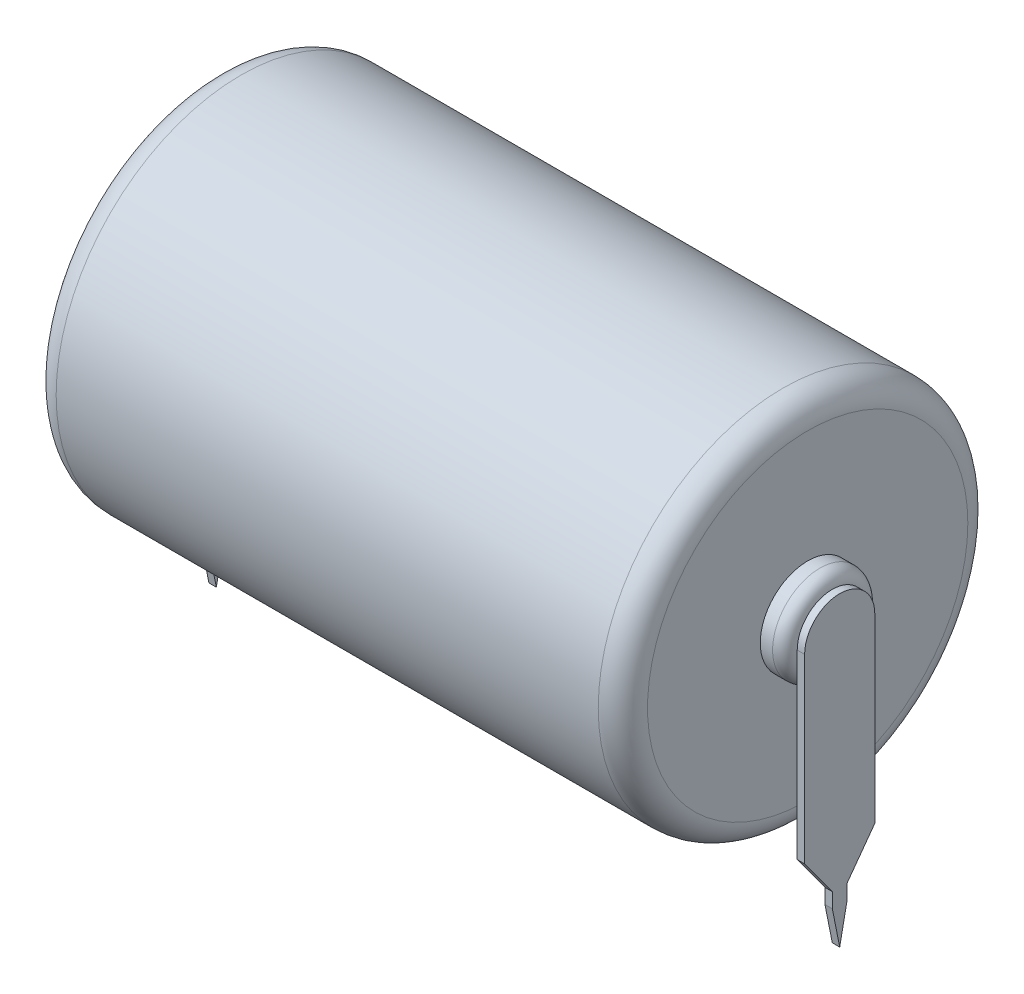
ISO-10303-21;
HEADER;
FILE_DESCRIPTION(('STEP AP214'),'2;1');
FILE_NAME('part.step','',(''),(''),'','','');
FILE_SCHEMA(('AUTOMOTIVE_DESIGN { 1 0 10303 214 1 1 1 1 }'));
ENDSEC;
DATA;
#1=APPLICATION_CONTEXT('core data for automotive mechanical design processes');
#2=APPLICATION_PROTOCOL_DEFINITION('international standard','automotive_design',2000,#1);
#3=PRODUCT_CONTEXT('',#1,'mechanical');
#4=PRODUCT('Part','Part','',(#3));
#5=PRODUCT_RELATED_PRODUCT_CATEGORY('part','',(#4));
#6=PRODUCT_DEFINITION_FORMATION('','',#4);
#7=PRODUCT_DEFINITION_CONTEXT('part definition',#1,'design');
#8=PRODUCT_DEFINITION('design','',#6,#7);
#9=PRODUCT_DEFINITION_SHAPE('','',#8);
#10=(LENGTH_UNIT() NAMED_UNIT(*) SI_UNIT(.MILLI.,.METRE.));
#11=(NAMED_UNIT(*) PLANE_ANGLE_UNIT() SI_UNIT($,.RADIAN.));
#12=(NAMED_UNIT(*) SI_UNIT($,.STERADIAN.) SOLID_ANGLE_UNIT());
#13=UNCERTAINTY_MEASURE_WITH_UNIT(LENGTH_MEASURE(1.E-05),#10,'distance_accuracy_value','');
#14=(GEOMETRIC_REPRESENTATION_CONTEXT(3) GLOBAL_UNCERTAINTY_ASSIGNED_CONTEXT((#13)) GLOBAL_UNIT_ASSIGNED_CONTEXT((#10,
#11,#12)) REPRESENTATION_CONTEXT('',''));
#15=CARTESIAN_POINT('',(0.,0.,0.));
#16=DIRECTION('',(0.,0.,1.));
#17=DIRECTION('',(1.,0.,0.));
#18=AXIS2_PLACEMENT_3D('',#15,#16,#17);
#19=CARTESIAN_POINT('',(0.,0.,0.));
#20=DIRECTION('',(1.,0.,0.));
#21=DIRECTION('',(0.,0.,-1.));
#22=AXIS2_PLACEMENT_3D('',#19,#20,#21);
#23=PLANE('',#22);
#24=DIRECTION('',(0.,-1.,0.));
#25=VECTOR('',#24,1.);
#26=CARTESIAN_POINT('',(0.,0.,-1.4242708064188));
#27=LINE('',#26,#25);
#28=CARTESIAN_POINT('',(0.,0.,-1.4242708064188));
#29=VERTEX_POINT('',#28);
#30=CARTESIAN_POINT('',(0.,-4.9161351994369,-1.4242708064188));
#31=VERTEX_POINT('',#30);
#32=EDGE_CURVE('E57',#29,#31,#27,.T.);
#33=ORIENTED_EDGE('',*,*,#32,.F.);
#34=CARTESIAN_POINT('',(0.,0.,0.));
#35=DIRECTION('',(-1.,0.,0.));
#36=DIRECTION('',(0.,0.,1.));
#37=AXIS2_PLACEMENT_3D('',#34,#35,#36);
#38=CIRCLE('',#37,1.4242708064188);
#39=CARTESIAN_POINT('',(0.,0.,1.4242708064188));
#40=VERTEX_POINT('',#39);
#41=EDGE_CURVE('E745',#40,#29,#38,.T.);
#42=ORIENTED_EDGE('',*,*,#41,.F.);
#43=DIRECTION('',(0.,1.,0.));
#44=VECTOR('',#43,1.);
#45=CARTESIAN_POINT('',(0.,-7.36352175728321,1.4242708064188));
#46=LINE('',#45,#44);
#47=CARTESIAN_POINT('',(0.,-4.9161351994369,1.4242708064188));
#48=VERTEX_POINT('',#47);
#49=EDGE_CURVE('E62',#48,#40,#46,.T.);
#50=ORIENTED_EDGE('',*,*,#49,.F.);
#51=CARTESIAN_POINT('',(0.,0.,0.));
#52=DIRECTION('',(-1.,0.,0.));
#53=DIRECTION('',(0.,0.,1.));
#54=AXIS2_PLACEMENT_3D('',#51,#52,#53);
#55=CIRCLE('',#54,5.11829391781669);
#56=EDGE_CURVE('E308',#48,#31,#55,.T.);
#57=ORIENTED_EDGE('',*,*,#56,.T.);
#58=EDGE_LOOP('',(#33,#42,#50,#57));
#59=FACE_BOUND('',#58,.T.);
#60=ADVANCED_FACE('F41',(#59),#23,.F.);
#61=CARTESIAN_POINT('',(0.,-6.34203852637172,1.4242708064188));
#62=VERTEX_POINT('',#61);
#63=CARTESIAN_POINT('',(0.,-5.28907681094109,1.4242708064188));
#64=VERTEX_POINT('',#63);
#65=EDGE_CURVE('E800',#62,#64,#46,.T.);
#66=ORIENTED_EDGE('',*,*,#65,.F.);
#67=CARTESIAN_POINT('',(0.,0.,0.));
#68=DIRECTION('',(1.,0.,0.));
#69=DIRECTION('',(0.,0.,-1.));
#70=AXIS2_PLACEMENT_3D('',#67,#68,#69);
#71=CIRCLE('',#70,6.5);
#72=CARTESIAN_POINT('',(0.,-6.34203852637172,-1.4242708064188));
#73=VERTEX_POINT('',#72);
#74=EDGE_CURVE('E338',#62,#73,#71,.F.);
#75=ORIENTED_EDGE('',*,*,#74,.T.);
#76=CARTESIAN_POINT('',(0.,-5.28907681094109,-1.4242708064188));
#77=VERTEX_POINT('',#76);
#78=EDGE_CURVE('E734',#77,#73,#27,.T.);
#79=ORIENTED_EDGE('',*,*,#78,.F.);
#80=CARTESIAN_POINT('',(0.,0.,0.));
#81=DIRECTION('',(-1.,0.,0.));
#82=DIRECTION('',(0.,0.,1.));
#83=AXIS2_PLACEMENT_3D('',#80,#81,#82);
#84=CIRCLE('',#83,5.47748855243456);
#85=EDGE_CURVE('E313',#64,#77,#84,.T.);
#86=ORIENTED_EDGE('',*,*,#85,.F.);
#87=EDGE_LOOP('',(#66,#75,#79,#86));
#88=FACE_BOUND('',#87,.T.);
#89=ADVANCED_FACE('F406',(#88),#23,.F.);
#90=CARTESIAN_POINT('',(24.,0.,0.));
#91=DIRECTION('',(-1.,0.,0.));
#92=DIRECTION('',(0.,0.,1.));
#93=AXIS2_PLACEMENT_3D('',#90,#91,#92);
#94=CYLINDRICAL_SURFACE('',#93,7.5);
#95=CARTESIAN_POINT('',(1.,0.,0.));
#96=DIRECTION('',(1.,0.,0.));
#97=DIRECTION('',(0.,0.,-1.));
#98=AXIS2_PLACEMENT_3D('',#95,#96,#97);
#99=CIRCLE('',#98,7.5);
#100=CARTESIAN_POINT('',(1.,0.,-7.5));
#101=VERTEX_POINT('',#100);
#102=EDGE_CURVE('E334',#101,#101,#99,.T.);
#103=ORIENTED_EDGE('',*,*,#102,.T.);
#104=EDGE_LOOP('',(#103));
#105=FACE_BOUND('',#104,.T.);
#106=CARTESIAN_POINT('',(23.,0.,0.));
#107=DIRECTION('',(1.,0.,0.));
#108=DIRECTION('',(0.,0.,-1.));
#109=AXIS2_PLACEMENT_3D('',#106,#107,#108);
#110=CIRCLE('',#109,7.5);
#111=CARTESIAN_POINT('',(23.,0.,-7.5));
#112=VERTEX_POINT('',#111);
#113=EDGE_CURVE('E330',#112,#112,#110,.F.);
#114=ORIENTED_EDGE('',*,*,#113,.T.);
#115=EDGE_LOOP('',(#114));
#116=FACE_BOUND('',#115,.T.);
#117=ADVANCED_FACE('F411',(#105,#116),#94,.T.);
#118=CARTESIAN_POINT('',(24.,0.,0.));
#119=DIRECTION('',(1.,0.,0.));
#120=DIRECTION('',(0.,0.,-1.));
#121=AXIS2_PLACEMENT_3D('',#118,#119,#120);
#122=PLANE('',#121);
#123=CARTESIAN_POINT('',(24.,0.,0.));
#124=DIRECTION('',(1.,0.,0.));
#125=DIRECTION('',(0.,0.,-1.));
#126=AXIS2_PLACEMENT_3D('',#123,#124,#125);
#127=CIRCLE('',#126,1.9242708064188);
#128=CARTESIAN_POINT('',(24.,0.,-1.9242708064188));
#129=VERTEX_POINT('',#128);
#130=EDGE_CURVE('E322',#129,#129,#127,.T.);
#131=ORIENTED_EDGE('',*,*,#130,.F.);
#132=EDGE_LOOP('',(#131));
#133=FACE_BOUND('',#132,.T.);
#134=CARTESIAN_POINT('',(24.,0.,0.));
#135=DIRECTION('',(1.,0.,0.));
#136=DIRECTION('',(0.,0.,-1.));
#137=AXIS2_PLACEMENT_3D('',#134,#135,#136);
#138=CIRCLE('',#137,6.5);
#139=CARTESIAN_POINT('',(24.,0.,-6.5));
#140=VERTEX_POINT('',#139);
#141=EDGE_CURVE('E342',#140,#140,#138,.T.);
#142=ORIENTED_EDGE('',*,*,#141,.T.);
#143=EDGE_LOOP('',(#142));
#144=FACE_BOUND('',#143,.T.);
#145=ADVANCED_FACE('F415',(#133,#144),#122,.T.);
#146=CARTESIAN_POINT('',(1.,0.,0.));
#147=DIRECTION('',(1.,0.,0.));
#148=DIRECTION('',(0.,0.,-1.));
#149=AXIS2_PLACEMENT_3D('',#146,#147,#148);
#150=TOROIDAL_SURFACE('',#149,6.5,1.);
#151=EDGE_CURVE('E339',#73,#62,#71,.F.);
#152=ORIENTED_EDGE('',*,*,#151,.F.);
#153=ORIENTED_EDGE('',*,*,#74,.F.);
#154=EDGE_LOOP('',(#152,#153));
#155=FACE_BOUND('',#154,.T.);
#156=ORIENTED_EDGE('',*,*,#102,.F.);
#157=EDGE_LOOP('',(#156));
#158=FACE_BOUND('',#157,.T.);
#159=ADVANCED_FACE('F420',(#155,#158),#150,.T.);
#160=CARTESIAN_POINT('',(23.,0.,0.));
#161=DIRECTION('',(1.,0.,0.));
#162=DIRECTION('',(0.,0.,-1.));
#163=AXIS2_PLACEMENT_3D('',#160,#161,#162);
#164=TOROIDAL_SURFACE('',#163,6.5,1.);
#165=ORIENTED_EDGE('',*,*,#113,.F.);
#166=EDGE_LOOP('',(#165));
#167=FACE_BOUND('',#166,.T.);
#168=ORIENTED_EDGE('',*,*,#141,.F.);
#169=EDGE_LOOP('',(#168));
#170=FACE_BOUND('',#169,.T.);
#171=ADVANCED_FACE('F422',(#167,#170),#164,.T.);
#172=CARTESIAN_POINT('',(25.,0.,0.));
#173=DIRECTION('',(-1.,0.,0.));
#174=DIRECTION('',(0.,0.,1.));
#175=AXIS2_PLACEMENT_3D('',#172,#173,#174);
#176=CYLINDRICAL_SURFACE('',#175,1.9242708064188);
#177=CARTESIAN_POINT('',(24.5,0.,0.));
#178=DIRECTION('',(1.,0.,0.));
#179=DIRECTION('',(0.,0.,-1.));
#180=AXIS2_PLACEMENT_3D('',#177,#178,#179);
#181=CIRCLE('',#180,1.9242708064188);
#182=CARTESIAN_POINT('',(24.5,0.,-1.9242708064188));
#183=VERTEX_POINT('',#182);
#184=EDGE_CURVE('E11',#183,#183,#181,.F.);
#185=ORIENTED_EDGE('',*,*,#184,.T.);
#186=EDGE_LOOP('',(#185));
#187=FACE_BOUND('',#186,.T.);
#188=ORIENTED_EDGE('',*,*,#130,.T.);
#189=EDGE_LOOP('',(#188));
#190=FACE_BOUND('',#189,.T.);
#191=ADVANCED_FACE('F425',(#187,#190),#176,.T.);
#192=CARTESIAN_POINT('',(24.5,0.,0.));
#193=DIRECTION('',(1.,0.,0.));
#194=DIRECTION('',(0.,0.,-1.));
#195=AXIS2_PLACEMENT_3D('',#192,#193,#194);
#196=TOROIDAL_SURFACE('',#195,1.4242708064188,0.5);
#197=ORIENTED_EDGE('',*,*,#184,.F.);
#198=EDGE_LOOP('',(#197));
#199=FACE_BOUND('',#198,.T.);
#200=CARTESIAN_POINT('',(25.,0.,0.));
#201=DIRECTION('',(1.,0.,0.));
#202=DIRECTION('',(0.,0.,-1.));
#203=AXIS2_PLACEMENT_3D('',#200,#201,#202);
#204=CIRCLE('',#203,1.4242708064188);
#205=CARTESIAN_POINT('',(25.,0.,-1.4242708064188));
#206=VERTEX_POINT('',#205);
#207=CARTESIAN_POINT('',(25.,0.,1.4242708064188));
#208=VERTEX_POINT('',#207);
#209=EDGE_CURVE('E50',#206,#208,#204,.T.);
#210=ORIENTED_EDGE('',*,*,#209,.F.);
#211=EDGE_CURVE('E345',#208,#206,#204,.T.);
#212=ORIENTED_EDGE('',*,*,#211,.F.);
#213=EDGE_LOOP('',(#210,#212));
#214=FACE_BOUND('',#213,.T.);
#215=ADVANCED_FACE('F43',(#199,#214),#196,.T.);
#216=CARTESIAN_POINT('',(0.3,0.,0.));
#217=DIRECTION('',(-1.,0.,0.));
#218=DIRECTION('',(0.,0.,1.));
#219=AXIS2_PLACEMENT_3D('',#216,#217,#218);
#220=CYLINDRICAL_SURFACE('',#219,5.47748855243456);
#221=CARTESIAN_POINT('',(0.3,0.,0.));
#222=DIRECTION('',(-1.,0.,0.));
#223=DIRECTION('',(0.,0.,1.));
#224=AXIS2_PLACEMENT_3D('',#221,#222,#223);
#225=CIRCLE('',#224,5.47748855243456);
#226=CARTESIAN_POINT('',(0.3,0.,5.47748855243456));
#227=VERTEX_POINT('',#226);
#228=EDGE_CURVE('E318',#227,#227,#225,.T.);
#229=ORIENTED_EDGE('',*,*,#228,.F.);
#230=EDGE_LOOP('',(#229));
#231=FACE_BOUND('',#230,.T.);
#232=EDGE_CURVE('E323',#77,#64,#84,.T.);
#233=ORIENTED_EDGE('',*,*,#232,.T.);
#234=ORIENTED_EDGE('',*,*,#85,.T.);
#235=EDGE_LOOP('',(#233,#234));
#236=FACE_BOUND('',#235,.T.);
#237=ADVANCED_FACE('F457',(#231,#236),#220,.F.);
#238=CARTESIAN_POINT('',(0.3,0.,0.));
#239=DIRECTION('',(-1.,0.,0.));
#240=DIRECTION('',(0.,0.,1.));
#241=AXIS2_PLACEMENT_3D('',#238,#239,#240);
#242=PLANE('',#241);
#243=CARTESIAN_POINT('',(0.3,0.,0.));
#244=DIRECTION('',(-1.,0.,0.));
#245=DIRECTION('',(0.,0.,1.));
#246=AXIS2_PLACEMENT_3D('',#243,#244,#245);
#247=CIRCLE('',#246,5.11829391781669);
#248=CARTESIAN_POINT('',(0.3,0.,5.11829391781669));
#249=VERTEX_POINT('',#248);
#250=EDGE_CURVE('E309',#249,#249,#247,.T.);
#251=ORIENTED_EDGE('',*,*,#250,.F.);
#252=EDGE_LOOP('',(#251));
#253=FACE_BOUND('',#252,.T.);
#254=ORIENTED_EDGE('',*,*,#228,.T.);
#255=EDGE_LOOP('',(#254));
#256=FACE_BOUND('',#255,.T.);
#257=ADVANCED_FACE('F462',(#253,#256),#242,.T.);
#258=CARTESIAN_POINT('',(0.3,0.,0.));
#259=DIRECTION('',(-1.,0.,0.));
#260=DIRECTION('',(0.,0.,1.));
#261=AXIS2_PLACEMENT_3D('',#258,#259,#260);
#262=CYLINDRICAL_SURFACE('',#261,5.11829391781669);
#263=ORIENTED_EDGE('',*,*,#250,.T.);
#264=EDGE_LOOP('',(#263));
#265=FACE_BOUND('',#264,.T.);
#266=EDGE_CURVE('E314',#31,#48,#55,.T.);
#267=ORIENTED_EDGE('',*,*,#266,.F.);
#268=ORIENTED_EDGE('',*,*,#56,.F.);
#269=EDGE_LOOP('',(#267,#268));
#270=FACE_BOUND('',#269,.T.);
#271=ADVANCED_FACE('F403',(#265,#270),#262,.T.);
#272=CARTESIAN_POINT('',(25.3,0.,0.));
#273=DIRECTION('',(-1.,0.,0.));
#274=DIRECTION('',(0.,0.,1.));
#275=AXIS2_PLACEMENT_3D('',#272,#273,#274);
#276=CYLINDRICAL_SURFACE('',#275,1.4242708064188);
#277=ORIENTED_EDGE('',*,*,#209,.T.);
#278=DIRECTION('',(-1.,0.,0.));
#279=VECTOR('',#278,1.);
#280=CARTESIAN_POINT('',(25.3,0.,1.4242708064188));
#281=LINE('',#280,#279);
#282=CARTESIAN_POINT('',(25.3,0.,1.4242708064188));
#283=VERTEX_POINT('',#282);
#284=EDGE_CURVE('E304',#283,#208,#281,.T.);
#285=ORIENTED_EDGE('',*,*,#284,.F.);
#286=CARTESIAN_POINT('',(25.3,0.,0.));
#287=DIRECTION('',(1.,0.,0.));
#288=DIRECTION('',(0.,0.,-1.));
#289=AXIS2_PLACEMENT_3D('',#286,#287,#288);
#290=CIRCLE('',#289,1.4242708064188);
#291=CARTESIAN_POINT('',(25.3,0.,-1.4242708064188));
#292=VERTEX_POINT('',#291);
#293=EDGE_CURVE('E222',#292,#283,#290,.T.);
#294=ORIENTED_EDGE('',*,*,#293,.F.);
#295=DIRECTION('',(-1.,0.,0.));
#296=VECTOR('',#295,1.);
#297=CARTESIAN_POINT('',(25.3,0.,-1.4242708064188));
#298=LINE('',#297,#296);
#299=EDGE_CURVE('E250',#292,#206,#298,.T.);
#300=ORIENTED_EDGE('',*,*,#299,.T.);
#301=EDGE_LOOP('',(#277,#285,#294,#300));
#302=FACE_BOUND('',#301,.T.);
#303=ADVANCED_FACE('F363',(#302),#276,.T.);
#304=CARTESIAN_POINT('',(25.3,0.,1.4242708064188));
#305=DIRECTION('',(0.,0.,-1.));
#306=DIRECTION('',(-1.,0.,0.));
#307=AXIS2_PLACEMENT_3D('',#304,#305,#306);
#308=PLANE('',#307);
#309=DIRECTION('',(0.,-1.,0.));
#310=VECTOR('',#309,1.);
#311=CARTESIAN_POINT('',(25.,0.,1.4242708064188));
#312=LINE('',#311,#310);
#313=CARTESIAN_POINT('',(25.,-7.36352175728321,1.4242708064188));
#314=VERTEX_POINT('',#313);
#315=EDGE_CURVE('E211',#208,#314,#312,.T.);
#316=ORIENTED_EDGE('',*,*,#315,.T.);
#317=DIRECTION('',(-1.,0.,0.));
#318=VECTOR('',#317,1.);
#319=CARTESIAN_POINT('',(25.3,-7.36352175728321,1.4242708064188));
#320=LINE('',#319,#318);
#321=CARTESIAN_POINT('',(25.3,-7.36352175728321,1.4242708064188));
#322=VERTEX_POINT('',#321);
#323=EDGE_CURVE('E300',#322,#314,#320,.T.);
#324=ORIENTED_EDGE('',*,*,#323,.F.);
#325=DIRECTION('',(0.,-1.,0.));
#326=VECTOR('',#325,1.);
#327=CARTESIAN_POINT('',(25.3,0.,1.4242708064188));
#328=LINE('',#327,#326);
#329=EDGE_CURVE('E226',#283,#322,#328,.T.);
#330=ORIENTED_EDGE('',*,*,#329,.F.);
#331=ORIENTED_EDGE('',*,*,#284,.T.);
#332=EDGE_LOOP('',(#316,#324,#330,#331));
#333=FACE_BOUND('',#332,.T.);
#334=ADVANCED_FACE('F395',(#333),#308,.F.);
#335=CARTESIAN_POINT('',(25.3,-8.61036931533486,0.511928366025113));
#336=DIRECTION('',(0.,0.590516300354505,-0.807025711496002));
#337=DIRECTION('',(0.,0.807025711496002,0.590516300354505));
#338=AXIS2_PLACEMENT_3D('',#335,#336,#337);
#339=PLANE('',#338);
#340=DIRECTION('',(0.,-0.807025711496002,-0.590516300354505));
#341=VECTOR('',#340,1.);
#342=CARTESIAN_POINT('',(25.,-8.61036931533486,0.511928366025113));
#343=LINE('',#342,#341);
#344=CARTESIAN_POINT('',(25.,-8.9,0.3));
#345=VERTEX_POINT('',#344);
#346=EDGE_CURVE('E216',#314,#345,#343,.T.);
#347=ORIENTED_EDGE('',*,*,#346,.T.);
#348=DIRECTION('',(-1.,0.,0.));
#349=VECTOR('',#348,1.);
#350=CARTESIAN_POINT('',(25.3,-8.9,0.3));
#351=LINE('',#350,#349);
#352=CARTESIAN_POINT('',(25.3,-8.9,0.3));
#353=VERTEX_POINT('',#352);
#354=EDGE_CURVE('E296',#353,#345,#351,.T.);
#355=ORIENTED_EDGE('',*,*,#354,.F.);
#356=DIRECTION('',(0.,-0.807025711496001,-0.590516300354506));
#357=VECTOR('',#356,1.);
#358=CARTESIAN_POINT('',(25.3,-7.36352175728321,1.4242708064188));
#359=LINE('',#358,#357);
#360=EDGE_CURVE('E230',#322,#353,#359,.T.);
#361=ORIENTED_EDGE('',*,*,#360,.F.);
#362=ORIENTED_EDGE('',*,*,#323,.T.);
#363=EDGE_LOOP('',(#347,#355,#361,#362));
#364=FACE_BOUND('',#363,.T.);
#365=ADVANCED_FACE('F393',(#364),#339,.F.);
#366=CARTESIAN_POINT('',(25.3,-8.9,0.3));
#367=DIRECTION('',(0.,0.,-1.));
#368=DIRECTION('',(0.,1.,0.));
#369=AXIS2_PLACEMENT_3D('',#366,#367,#368);
#370=PLANE('',#369);
#371=DIRECTION('',(0.,-1.,0.));
#372=VECTOR('',#371,1.);
#373=CARTESIAN_POINT('',(25.,-8.9,0.3));
#374=LINE('',#373,#372);
#375=CARTESIAN_POINT('',(25.,-9.5,0.3));
#376=VERTEX_POINT('',#375);
#377=EDGE_CURVE('E254',#345,#376,#374,.T.);
#378=ORIENTED_EDGE('',*,*,#377,.T.);
#379=DIRECTION('',(-1.,0.,0.));
#380=VECTOR('',#379,1.);
#381=CARTESIAN_POINT('',(25.3,-9.5,0.3));
#382=LINE('',#381,#380);
#383=CARTESIAN_POINT('',(25.3,-9.5,0.3));
#384=VERTEX_POINT('',#383);
#385=EDGE_CURVE('E292',#384,#376,#382,.T.);
#386=ORIENTED_EDGE('',*,*,#385,.F.);
#387=DIRECTION('',(0.,-1.,0.));
#388=VECTOR('',#387,1.);
#389=CARTESIAN_POINT('',(25.3,-8.9,0.3));
#390=LINE('',#389,#388);
#391=EDGE_CURVE('E233',#353,#384,#390,.T.);
#392=ORIENTED_EDGE('',*,*,#391,.F.);
#393=ORIENTED_EDGE('',*,*,#354,.T.);
#394=EDGE_LOOP('',(#378,#386,#392,#393));
#395=FACE_BOUND('',#394,.T.);
#396=ADVANCED_FACE('F389',(#395),#370,.F.);
#397=CARTESIAN_POINT('',(25.3,-9.5,0.3));
#398=DIRECTION('',(0.,0.196116135138184,-0.98058067569092));
#399=DIRECTION('',(0.,0.98058067569092,0.196116135138184));
#400=AXIS2_PLACEMENT_3D('',#397,#398,#399);
#401=PLANE('',#400);
#402=DIRECTION('',(0.,-0.98058067569092,-0.196116135138184));
#403=VECTOR('',#402,1.);
#404=CARTESIAN_POINT('',(25.,-9.5,0.3));
#405=LINE('',#404,#403);
#406=CARTESIAN_POINT('',(25.,-11.,0.));
#407=VERTEX_POINT('',#406);
#408=EDGE_CURVE('E257',#376,#407,#405,.T.);
#409=ORIENTED_EDGE('',*,*,#408,.T.);
#410=DIRECTION('',(-1.,0.,0.));
#411=VECTOR('',#410,1.);
#412=CARTESIAN_POINT('',(25.3,-11.,0.));
#413=LINE('',#412,#411);
#414=CARTESIAN_POINT('',(25.3,-11.,0.));
#415=VERTEX_POINT('',#414);
#416=EDGE_CURVE('E288',#415,#407,#413,.T.);
#417=ORIENTED_EDGE('',*,*,#416,.F.);
#418=DIRECTION('',(0.,-0.98058067569092,-0.196116135138184));
#419=VECTOR('',#418,1.);
#420=CARTESIAN_POINT('',(25.3,-9.5,0.3));
#421=LINE('',#420,#419);
#422=EDGE_CURVE('E236',#384,#415,#421,.T.);
#423=ORIENTED_EDGE('',*,*,#422,.F.);
#424=ORIENTED_EDGE('',*,*,#385,.T.);
#425=EDGE_LOOP('',(#409,#417,#423,#424));
#426=FACE_BOUND('',#425,.T.);
#427=ADVANCED_FACE('F384',(#426),#401,.F.);
#428=CARTESIAN_POINT('',(25.3,-9.5,-0.3));
#429=DIRECTION('',(0.,0.196116135138184,0.98058067569092));
#430=DIRECTION('',(0.,-0.98058067569092,0.196116135138184));
#431=AXIS2_PLACEMENT_3D('',#428,#429,#430);
#432=PLANE('',#431);
#433=DIRECTION('',(0.,0.98058067569092,-0.196116135138184));
#434=VECTOR('',#433,1.);
#435=CARTESIAN_POINT('',(25.,-9.5,-0.3));
#436=LINE('',#435,#434);
#437=CARTESIAN_POINT('',(25.,-9.5,-0.3));
#438=VERTEX_POINT('',#437);
#439=EDGE_CURVE('E260',#407,#438,#436,.T.);
#440=ORIENTED_EDGE('',*,*,#439,.T.);
#441=DIRECTION('',(-1.,0.,0.));
#442=VECTOR('',#441,1.);
#443=CARTESIAN_POINT('',(25.3,-9.5,-0.3));
#444=LINE('',#443,#442);
#445=CARTESIAN_POINT('',(25.3,-9.5,-0.3));
#446=VERTEX_POINT('',#445);
#447=EDGE_CURVE('E284',#446,#438,#444,.T.);
#448=ORIENTED_EDGE('',*,*,#447,.F.);
#449=DIRECTION('',(0.,0.98058067569092,-0.196116135138184));
#450=VECTOR('',#449,1.);
#451=CARTESIAN_POINT('',(25.3,-9.5,-0.3));
#452=LINE('',#451,#450);
#453=EDGE_CURVE('E239',#415,#446,#452,.T.);
#454=ORIENTED_EDGE('',*,*,#453,.F.);
#455=ORIENTED_EDGE('',*,*,#416,.T.);
#456=EDGE_LOOP('',(#440,#448,#454,#455));
#457=FACE_BOUND('',#456,.T.);
#458=ADVANCED_FACE('F379',(#457),#432,.F.);
#459=CARTESIAN_POINT('',(25.3,-8.9,-0.3));
#460=DIRECTION('',(0.,0.,1.));
#461=DIRECTION('',(0.,-1.,0.));
#462=AXIS2_PLACEMENT_3D('',#459,#460,#461);
#463=PLANE('',#462);
#464=DIRECTION('',(0.,1.,0.));
#465=VECTOR('',#464,1.);
#466=CARTESIAN_POINT('',(25.,-8.9,-0.3));
#467=LINE('',#466,#465);
#468=CARTESIAN_POINT('',(25.,-8.9,-0.3));
#469=VERTEX_POINT('',#468);
#470=EDGE_CURVE('E263',#438,#469,#467,.T.);
#471=ORIENTED_EDGE('',*,*,#470,.T.);
#472=DIRECTION('',(-1.,0.,0.));
#473=VECTOR('',#472,1.);
#474=CARTESIAN_POINT('',(25.3,-8.9,-0.3));
#475=LINE('',#474,#473);
#476=CARTESIAN_POINT('',(25.3,-8.9,-0.3));
#477=VERTEX_POINT('',#476);
#478=EDGE_CURVE('E280',#477,#469,#475,.T.);
#479=ORIENTED_EDGE('',*,*,#478,.F.);
#480=DIRECTION('',(0.,1.,0.));
#481=VECTOR('',#480,1.);
#482=CARTESIAN_POINT('',(25.3,-8.9,-0.3));
#483=LINE('',#482,#481);
#484=EDGE_CURVE('E242',#446,#477,#483,.T.);
#485=ORIENTED_EDGE('',*,*,#484,.F.);
#486=ORIENTED_EDGE('',*,*,#447,.T.);
#487=EDGE_LOOP('',(#471,#479,#485,#486));
#488=FACE_BOUND('',#487,.T.);
#489=ADVANCED_FACE('F375',(#488),#463,.F.);
#490=CARTESIAN_POINT('',(25.3,-7.36352175728321,-1.4242708064188));
#491=DIRECTION('',(0.,0.590516300354505,0.807025711496002));
#492=DIRECTION('',(0.,-0.807025711496002,0.590516300354505));
#493=AXIS2_PLACEMENT_3D('',#490,#491,#492);
#494=PLANE('',#493);
#495=DIRECTION('',(0.,0.807025711496002,-0.590516300354505));
#496=VECTOR('',#495,1.);
#497=CARTESIAN_POINT('',(25.,-7.36352175728321,-1.4242708064188));
#498=LINE('',#497,#496);
#499=CARTESIAN_POINT('',(25.,-7.36352175728321,-1.4242708064188));
#500=VERTEX_POINT('',#499);
#501=EDGE_CURVE('E267',#469,#500,#498,.T.);
#502=ORIENTED_EDGE('',*,*,#501,.T.);
#503=DIRECTION('',(-1.,0.,0.));
#504=VECTOR('',#503,1.);
#505=CARTESIAN_POINT('',(25.3,-7.36352175728321,-1.4242708064188));
#506=LINE('',#505,#504);
#507=CARTESIAN_POINT('',(25.3,-7.36352175728321,-1.4242708064188));
#508=VERTEX_POINT('',#507);
#509=EDGE_CURVE('E276',#508,#500,#506,.T.);
#510=ORIENTED_EDGE('',*,*,#509,.F.);
#511=DIRECTION('',(0.,0.807025711496,-0.590516300354508));
#512=VECTOR('',#511,1.);
#513=CARTESIAN_POINT('',(25.3,-8.59862377608803,-0.520522803950577));
#514=LINE('',#513,#512);
#515=EDGE_CURVE('E245',#477,#508,#514,.T.);
#516=ORIENTED_EDGE('',*,*,#515,.F.);
#517=ORIENTED_EDGE('',*,*,#478,.T.);
#518=EDGE_LOOP('',(#502,#510,#516,#517));
#519=FACE_BOUND('',#518,.T.);
#520=ADVANCED_FACE('F371',(#519),#494,.F.);
#521=CARTESIAN_POINT('',(25.3,0.,-1.4242708064188));
#522=DIRECTION('',(0.,0.,1.));
#523=DIRECTION('',(1.,0.,0.));
#524=AXIS2_PLACEMENT_3D('',#521,#522,#523);
#525=PLANE('',#524);
#526=DIRECTION('',(0.,1.,0.));
#527=VECTOR('',#526,1.);
#528=CARTESIAN_POINT('',(25.,0.,-1.4242708064188));
#529=LINE('',#528,#527);
#530=EDGE_CURVE('E227',#500,#206,#529,.T.);
#531=ORIENTED_EDGE('',*,*,#530,.T.);
#532=ORIENTED_EDGE('',*,*,#299,.F.);
#533=DIRECTION('',(0.,1.,0.));
#534=VECTOR('',#533,1.);
#535=CARTESIAN_POINT('',(25.3,0.,-1.4242708064188));
#536=LINE('',#535,#534);
#537=EDGE_CURVE('E248',#508,#292,#536,.T.);
#538=ORIENTED_EDGE('',*,*,#537,.F.);
#539=ORIENTED_EDGE('',*,*,#509,.T.);
#540=EDGE_LOOP('',(#531,#532,#538,#539));
#541=FACE_BOUND('',#540,.T.);
#542=ADVANCED_FACE('F359',(#541),#525,.F.);
#543=CARTESIAN_POINT('',(25.3,0.,0.));
#544=DIRECTION('',(1.,0.,0.));
#545=DIRECTION('',(0.,0.,-1.));
#546=AXIS2_PLACEMENT_3D('',#543,#544,#545);
#547=PLANE('',#546);
#548=ORIENTED_EDGE('',*,*,#293,.T.);
#549=ORIENTED_EDGE('',*,*,#329,.T.);
#550=ORIENTED_EDGE('',*,*,#360,.T.);
#551=ORIENTED_EDGE('',*,*,#391,.T.);
#552=ORIENTED_EDGE('',*,*,#422,.T.);
#553=ORIENTED_EDGE('',*,*,#453,.T.);
#554=ORIENTED_EDGE('',*,*,#484,.T.);
#555=ORIENTED_EDGE('',*,*,#515,.T.);
#556=ORIENTED_EDGE('',*,*,#537,.T.);
#557=EDGE_LOOP('',(#548,#549,#550,#551,#552,#553,#554,#555,#556));
#558=FACE_BOUND('',#557,.T.);
#559=ADVANCED_FACE('F365',(#558),#547,.T.);
#560=CARTESIAN_POINT('',(25.,0.,0.));
#561=DIRECTION('',(1.,0.,0.));
#562=DIRECTION('',(0.,0.,-1.));
#563=AXIS2_PLACEMENT_3D('',#560,#561,#562);
#564=PLANE('',#563);
#565=ORIENTED_EDGE('',*,*,#211,.T.);
#566=ORIENTED_EDGE('',*,*,#530,.F.);
#567=ORIENTED_EDGE('',*,*,#501,.F.);
#568=ORIENTED_EDGE('',*,*,#470,.F.);
#569=ORIENTED_EDGE('',*,*,#439,.F.);
#570=ORIENTED_EDGE('',*,*,#408,.F.);
#571=ORIENTED_EDGE('',*,*,#377,.F.);
#572=ORIENTED_EDGE('',*,*,#346,.F.);
#573=ORIENTED_EDGE('',*,*,#315,.F.);
#574=EDGE_LOOP('',(#565,#566,#567,#568,#569,#570,#571,#572,#573));
#575=FACE_BOUND('',#574,.T.);
#576=ADVANCED_FACE('F355',(#575),#564,.F.);
#577=CARTESIAN_POINT('',(0.,0.,0.));
#578=DIRECTION('',(-1.,0.,0.));
#579=DIRECTION('',(0.,0.,1.));
#580=AXIS2_PLACEMENT_3D('',#577,#578,#579);
#581=PLANE('',#580);
#582=EDGE_CURVE('E729',#31,#77,#27,.T.);
#583=ORIENTED_EDGE('',*,*,#582,.F.);
#584=ORIENTED_EDGE('',*,*,#266,.T.);
#585=EDGE_CURVE('E731',#64,#48,#46,.T.);
#586=ORIENTED_EDGE('',*,*,#585,.F.);
#587=ORIENTED_EDGE('',*,*,#232,.F.);
#588=EDGE_LOOP('',(#583,#584,#586,#587));
#589=FACE_BOUND('',#588,.T.);
#590=ADVANCED_FACE('F482',(#589),#581,.F.);
#591=CARTESIAN_POINT('',(0.,-7.36352175728321,-1.4242708064188));
#592=VERTEX_POINT('',#591);
#593=EDGE_CURVE('E743',#73,#592,#27,.T.);
#594=ORIENTED_EDGE('',*,*,#593,.F.);
#595=ORIENTED_EDGE('',*,*,#151,.T.);
#596=CARTESIAN_POINT('',(0.,-7.36352175728321,1.4242708064188));
#597=VERTEX_POINT('',#596);
#598=EDGE_CURVE('E797',#597,#62,#46,.T.);
#599=ORIENTED_EDGE('',*,*,#598,.F.);
#600=DIRECTION('',(0.,0.807025711496001,0.590516300354506));
#601=VECTOR('',#600,1.);
#602=CARTESIAN_POINT('',(0.,-8.61036931533486,0.511928366025113));
#603=LINE('',#602,#601);
#604=CARTESIAN_POINT('',(0.,-8.9,0.3));
#605=VERTEX_POINT('',#604);
#606=EDGE_CURVE('E790',#605,#597,#603,.T.);
#607=ORIENTED_EDGE('',*,*,#606,.F.);
#608=DIRECTION('',(0.,1.,0.));
#609=VECTOR('',#608,1.);
#610=CARTESIAN_POINT('',(0.,-9.5,0.3));
#611=LINE('',#610,#609);
#612=CARTESIAN_POINT('',(0.,-9.5,0.3));
#613=VERTEX_POINT('',#612);
#614=EDGE_CURVE('E785',#613,#605,#611,.T.);
#615=ORIENTED_EDGE('',*,*,#614,.F.);
#616=DIRECTION('',(0.,0.98058067569092,0.196116135138184));
#617=VECTOR('',#616,1.);
#618=CARTESIAN_POINT('',(0.,-11.,0.));
#619=LINE('',#618,#617);
#620=CARTESIAN_POINT('',(0.,-11.,0.));
#621=VERTEX_POINT('',#620);
#622=EDGE_CURVE('E779',#621,#613,#619,.T.);
#623=ORIENTED_EDGE('',*,*,#622,.F.);
#624=DIRECTION('',(0.,-0.98058067569092,0.196116135138184));
#625=VECTOR('',#624,1.);
#626=CARTESIAN_POINT('',(0.,-9.5,-0.3));
#627=LINE('',#626,#625);
#628=CARTESIAN_POINT('',(0.,-9.5,-0.3));
#629=VERTEX_POINT('',#628);
#630=EDGE_CURVE('E783',#629,#621,#627,.T.);
#631=ORIENTED_EDGE('',*,*,#630,.F.);
#632=DIRECTION('',(0.,-1.,0.));
#633=VECTOR('',#632,1.);
#634=CARTESIAN_POINT('',(0.,-8.9,-0.3));
#635=LINE('',#634,#633);
#636=CARTESIAN_POINT('',(0.,-8.9,-0.3));
#637=VERTEX_POINT('',#636);
#638=EDGE_CURVE('E792',#637,#629,#635,.T.);
#639=ORIENTED_EDGE('',*,*,#638,.F.);
#640=DIRECTION('',(0.,-0.807025711496002,0.590516300354505));
#641=VECTOR('',#640,1.);
#642=CARTESIAN_POINT('',(0.,-7.36352175728321,-1.4242708064188));
#643=LINE('',#642,#641);
#644=EDGE_CURVE('E205',#592,#637,#643,.T.);
#645=ORIENTED_EDGE('',*,*,#644,.F.);
#646=EDGE_LOOP('',(#594,#595,#599,#607,#615,#623,#631,#639,#645));
#647=FACE_BOUND('',#646,.T.);
#648=ADVANCED_FACE('F487',(#647),#581,.F.);
#649=CARTESIAN_POINT('',(-0.3,-8.9,-0.3));
#650=DIRECTION('',(0.,0.,1.));
#651=DIRECTION('',(0.,-1.,0.));
#652=AXIS2_PLACEMENT_3D('',#649,#650,#651);
#653=PLANE('',#652);
#654=ORIENTED_EDGE('',*,*,#638,.T.);
#655=DIRECTION('',(1.,0.,0.));
#656=VECTOR('',#655,1.);
#657=CARTESIAN_POINT('',(-0.3,-9.5,-0.3));
#658=LINE('',#657,#656);
#659=CARTESIAN_POINT('',(-0.3,-9.5,-0.3));
#660=VERTEX_POINT('',#659);
#661=EDGE_CURVE('E190',#660,#629,#658,.T.);
#662=ORIENTED_EDGE('',*,*,#661,.F.);
#663=DIRECTION('',(0.,-1.,0.));
#664=VECTOR('',#663,1.);
#665=CARTESIAN_POINT('',(-0.3,-8.9,-0.3));
#666=LINE('',#665,#664);
#667=CARTESIAN_POINT('',(-0.3,-8.9,-0.3));
#668=VERTEX_POINT('',#667);
#669=EDGE_CURVE('E184',#668,#660,#666,.T.);
#670=ORIENTED_EDGE('',*,*,#669,.F.);
#671=DIRECTION('',(1.,0.,0.));
#672=VECTOR('',#671,1.);
#673=CARTESIAN_POINT('',(-0.3,-8.9,-0.3));
#674=LINE('',#673,#672);
#675=EDGE_CURVE('E188',#668,#637,#674,.T.);
#676=ORIENTED_EDGE('',*,*,#675,.T.);
#677=EDGE_LOOP('',(#654,#662,#670,#676));
#678=FACE_BOUND('',#677,.T.);
#679=ADVANCED_FACE('F186',(#678),#653,.F.);
#680=CARTESIAN_POINT('',(-0.3,-9.5,-0.3));
#681=DIRECTION('',(0.,0.196116135138184,0.98058067569092));
#682=DIRECTION('',(0.,-0.98058067569092,0.196116135138184));
#683=AXIS2_PLACEMENT_3D('',#680,#681,#682);
#684=PLANE('',#683);
#685=ORIENTED_EDGE('',*,*,#630,.T.);
#686=DIRECTION('',(1.,0.,0.));
#687=VECTOR('',#686,1.);
#688=CARTESIAN_POINT('',(-0.3,-11.,0.));
#689=LINE('',#688,#687);
#690=CARTESIAN_POINT('',(-0.3,-11.,0.));
#691=VERTEX_POINT('',#690);
#692=EDGE_CURVE('E218',#691,#621,#689,.T.);
#693=ORIENTED_EDGE('',*,*,#692,.F.);
#694=DIRECTION('',(0.,-0.98058067569092,0.196116135138184));
#695=VECTOR('',#694,1.);
#696=CARTESIAN_POINT('',(-0.3,-9.5,-0.3));
#697=LINE('',#696,#695);
#698=EDGE_CURVE('E194',#660,#691,#697,.T.);
#699=ORIENTED_EDGE('',*,*,#698,.F.);
#700=ORIENTED_EDGE('',*,*,#661,.T.);
#701=EDGE_LOOP('',(#685,#693,#699,#700));
#702=FACE_BOUND('',#701,.T.);
#703=ADVANCED_FACE('F507',(#702),#684,.F.);
#704=CARTESIAN_POINT('',(-0.3,-11.,0.));
#705=DIRECTION('',(0.,0.196116135138184,-0.98058067569092));
#706=DIRECTION('',(0.,0.98058067569092,0.196116135138184));
#707=AXIS2_PLACEMENT_3D('',#704,#705,#706);
#708=PLANE('',#707);
#709=ORIENTED_EDGE('',*,*,#622,.T.);
#710=DIRECTION('',(1.,0.,0.));
#711=VECTOR('',#710,1.);
#712=CARTESIAN_POINT('',(-0.3,-9.5,0.3));
#713=LINE('',#712,#711);
#714=CARTESIAN_POINT('',(-0.3,-9.5,0.3));
#715=VERTEX_POINT('',#714);
#716=EDGE_CURVE('E770',#715,#613,#713,.T.);
#717=ORIENTED_EDGE('',*,*,#716,.F.);
#718=DIRECTION('',(0.,0.98058067569092,0.196116135138184));
#719=VECTOR('',#718,1.);
#720=CARTESIAN_POINT('',(-0.3,-11.,0.));
#721=LINE('',#720,#719);
#722=EDGE_CURVE('E780',#691,#715,#721,.T.);
#723=ORIENTED_EDGE('',*,*,#722,.F.);
#724=ORIENTED_EDGE('',*,*,#692,.T.);
#725=EDGE_LOOP('',(#709,#717,#723,#724));
#726=FACE_BOUND('',#725,.T.);
#727=ADVANCED_FACE('F516',(#726),#708,.F.);
#728=CARTESIAN_POINT('',(-0.3,-9.5,0.3));
#729=DIRECTION('',(0.,0.,-1.));
#730=DIRECTION('',(0.,1.,0.));
#731=AXIS2_PLACEMENT_3D('',#728,#729,#730);
#732=PLANE('',#731);
#733=ORIENTED_EDGE('',*,*,#614,.T.);
#734=DIRECTION('',(1.,0.,0.));
#735=VECTOR('',#734,1.);
#736=CARTESIAN_POINT('',(-0.3,-8.9,0.3));
#737=LINE('',#736,#735);
#738=CARTESIAN_POINT('',(-0.3,-8.9,0.3));
#739=VERTEX_POINT('',#738);
#740=EDGE_CURVE('E766',#739,#605,#737,.T.);
#741=ORIENTED_EDGE('',*,*,#740,.F.);
#742=DIRECTION('',(0.,1.,0.));
#743=VECTOR('',#742,1.);
#744=CARTESIAN_POINT('',(-0.3,-9.5,0.3));
#745=LINE('',#744,#743);
#746=EDGE_CURVE('E825',#715,#739,#745,.T.);
#747=ORIENTED_EDGE('',*,*,#746,.F.);
#748=ORIENTED_EDGE('',*,*,#716,.T.);
#749=EDGE_LOOP('',(#733,#741,#747,#748));
#750=FACE_BOUND('',#749,.T.);
#751=ADVANCED_FACE('F526',(#750),#732,.F.);
#752=CARTESIAN_POINT('',(-0.3,-8.61036931533486,0.511928366025113));
#753=DIRECTION('',(0.,0.590516300354506,-0.807025711496001));
#754=DIRECTION('',(0.,0.807025711496001,0.590516300354506));
#755=AXIS2_PLACEMENT_3D('',#752,#753,#754);
#756=PLANE('',#755);
#757=ORIENTED_EDGE('',*,*,#606,.T.);
#758=DIRECTION('',(1.,0.,0.));
#759=VECTOR('',#758,1.);
#760=CARTESIAN_POINT('',(-0.3,-7.36352175728321,1.4242708064188));
#761=LINE('',#760,#759);
#762=CARTESIAN_POINT('',(-0.3,-7.36352175728321,1.4242708064188));
#763=VERTEX_POINT('',#762);
#764=EDGE_CURVE('E762',#763,#597,#761,.T.);
#765=ORIENTED_EDGE('',*,*,#764,.F.);
#766=DIRECTION('',(0.,0.807025711496002,0.590516300354505));
#767=VECTOR('',#766,1.);
#768=CARTESIAN_POINT('',(-0.3,-8.9,0.3));
#769=LINE('',#768,#767);
#770=EDGE_CURVE('E830',#739,#763,#769,.T.);
#771=ORIENTED_EDGE('',*,*,#770,.F.);
#772=ORIENTED_EDGE('',*,*,#740,.T.);
#773=EDGE_LOOP('',(#757,#765,#771,#772));
#774=FACE_BOUND('',#773,.T.);
#775=ADVANCED_FACE('F536',(#774),#756,.F.);
#776=CARTESIAN_POINT('',(-0.3,-7.36352175728321,1.4242708064188));
#777=DIRECTION('',(0.,0.,-1.));
#778=DIRECTION('',(-1.,0.,0.));
#779=AXIS2_PLACEMENT_3D('',#776,#777,#778);
#780=PLANE('',#779);
#781=ORIENTED_EDGE('',*,*,#598,.T.);
#782=ORIENTED_EDGE('',*,*,#65,.T.);
#783=ORIENTED_EDGE('',*,*,#585,.T.);
#784=ORIENTED_EDGE('',*,*,#49,.T.);
#785=DIRECTION('',(1.,0.,0.));
#786=VECTOR('',#785,1.);
#787=CARTESIAN_POINT('',(-0.3,0.,1.4242708064188));
#788=LINE('',#787,#786);
#789=CARTESIAN_POINT('',(-0.3,0.,1.4242708064188));
#790=VERTEX_POINT('',#789);
#791=EDGE_CURVE('E758',#790,#40,#788,.T.);
#792=ORIENTED_EDGE('',*,*,#791,.F.);
#793=DIRECTION('',(0.,1.,0.));
#794=VECTOR('',#793,1.);
#795=CARTESIAN_POINT('',(-0.3,-7.36352175728321,1.4242708064188));
#796=LINE('',#795,#794);
#797=EDGE_CURVE('E818',#763,#790,#796,.T.);
#798=ORIENTED_EDGE('',*,*,#797,.F.);
#799=ORIENTED_EDGE('',*,*,#764,.T.);
#800=EDGE_LOOP('',(#781,#782,#783,#784,#792,#798,#799));
#801=FACE_BOUND('',#800,.T.);
#802=ADVANCED_FACE('F547',(#801),#780,.F.);
#803=CARTESIAN_POINT('',(-0.3,0.,0.));
#804=DIRECTION('',(1.,0.,0.));
#805=DIRECTION('',(0.,0.,-1.));
#806=AXIS2_PLACEMENT_3D('',#803,#804,#805);
#807=CYLINDRICAL_SURFACE('',#806,1.4242708064188);
#808=ORIENTED_EDGE('',*,*,#41,.T.);
#809=DIRECTION('',(1.,0.,0.));
#810=VECTOR('',#809,1.);
#811=CARTESIAN_POINT('',(-0.3,0.,-1.4242708064188));
#812=LINE('',#811,#810);
#813=CARTESIAN_POINT('',(-0.3,0.,-1.4242708064188));
#814=VERTEX_POINT('',#813);
#815=EDGE_CURVE('E755',#814,#29,#812,.T.);
#816=ORIENTED_EDGE('',*,*,#815,.F.);
#817=CARTESIAN_POINT('',(-0.3,0.,0.));
#818=DIRECTION('',(-1.,0.,0.));
#819=DIRECTION('',(0.,0.,1.));
#820=AXIS2_PLACEMENT_3D('',#817,#818,#819);
#821=CIRCLE('',#820,1.4242708064188);
#822=EDGE_CURVE('E815',#790,#814,#821,.T.);
#823=ORIENTED_EDGE('',*,*,#822,.F.);
#824=ORIENTED_EDGE('',*,*,#791,.T.);
#825=EDGE_LOOP('',(#808,#816,#823,#824));
#826=FACE_BOUND('',#825,.T.);
#827=ADVANCED_FACE('F557',(#826),#807,.T.);
#828=CARTESIAN_POINT('',(-0.3,0.,-1.4242708064188));
#829=DIRECTION('',(0.,0.,1.));
#830=DIRECTION('',(1.,0.,0.));
#831=AXIS2_PLACEMENT_3D('',#828,#829,#830);
#832=PLANE('',#831);
#833=ORIENTED_EDGE('',*,*,#32,.T.);
#834=ORIENTED_EDGE('',*,*,#582,.T.);
#835=ORIENTED_EDGE('',*,*,#78,.T.);
#836=ORIENTED_EDGE('',*,*,#593,.T.);
#837=DIRECTION('',(1.,0.,0.));
#838=VECTOR('',#837,1.);
#839=CARTESIAN_POINT('',(-0.3,-7.36352175728321,-1.4242708064188));
#840=LINE('',#839,#838);
#841=CARTESIAN_POINT('',(-0.3,-7.36352175728321,-1.4242708064188));
#842=VERTEX_POINT('',#841);
#843=EDGE_CURVE('E752',#842,#592,#840,.T.);
#844=ORIENTED_EDGE('',*,*,#843,.F.);
#845=DIRECTION('',(0.,-1.,0.));
#846=VECTOR('',#845,1.);
#847=CARTESIAN_POINT('',(-0.3,0.,-1.4242708064188));
#848=LINE('',#847,#846);
#849=EDGE_CURVE('E200',#814,#842,#848,.T.);
#850=ORIENTED_EDGE('',*,*,#849,.F.);
#851=ORIENTED_EDGE('',*,*,#815,.T.);
#852=EDGE_LOOP('',(#833,#834,#835,#836,#844,#850,#851));
#853=FACE_BOUND('',#852,.T.);
#854=ADVANCED_FACE('F567',(#853),#832,.F.);
#855=CARTESIAN_POINT('',(-0.3,-7.36352175728321,-1.4242708064188));
#856=DIRECTION('',(0.,0.590516300354505,0.807025711496002));
#857=DIRECTION('',(0.,-0.807025711496002,0.590516300354505));
#858=AXIS2_PLACEMENT_3D('',#855,#856,#857);
#859=PLANE('',#858);
#860=ORIENTED_EDGE('',*,*,#644,.T.);
#861=ORIENTED_EDGE('',*,*,#675,.F.);
#862=DIRECTION('',(0.,-0.807025711496,0.590516300354508));
#863=VECTOR('',#862,1.);
#864=CARTESIAN_POINT('',(-0.3,-8.59862377608803,-0.520522803950577));
#865=LINE('',#864,#863);
#866=EDGE_CURVE('E195',#842,#668,#865,.T.);
#867=ORIENTED_EDGE('',*,*,#866,.F.);
#868=ORIENTED_EDGE('',*,*,#843,.T.);
#869=EDGE_LOOP('',(#860,#861,#867,#868));
#870=FACE_BOUND('',#869,.T.);
#871=ADVANCED_FACE('F207',(#870),#859,.F.);
#872=CARTESIAN_POINT('',(-0.3,0.,0.));
#873=DIRECTION('',(-1.,0.,0.));
#874=DIRECTION('',(0.,0.,1.));
#875=AXIS2_PLACEMENT_3D('',#872,#873,#874);
#876=PLANE('',#875);
#877=ORIENTED_EDGE('',*,*,#866,.T.);
#878=ORIENTED_EDGE('',*,*,#669,.T.);
#879=ORIENTED_EDGE('',*,*,#698,.T.);
#880=ORIENTED_EDGE('',*,*,#722,.T.);
#881=ORIENTED_EDGE('',*,*,#746,.T.);
#882=ORIENTED_EDGE('',*,*,#770,.T.);
#883=ORIENTED_EDGE('',*,*,#797,.T.);
#884=ORIENTED_EDGE('',*,*,#822,.T.);
#885=ORIENTED_EDGE('',*,*,#849,.T.);
#886=EDGE_LOOP('',(#877,#878,#879,#880,#881,#882,#883,#884,#885));
#887=FACE_BOUND('',#886,.T.);
#888=ADVANCED_FACE('F198',(#887),#876,.T.);
#889=CLOSED_SHELL('',(#60,#89,#117,#145,#159,#171,#191,#215,#237,#257,#271,#303,#334,#365,#396,
#427,#458,#489,#520,#542,#559,#576,#590,#648,#679,#703,#727,#751,#775,#802,#827,#854,#871,#888));
#890=MANIFOLD_SOLID_BREP('B2',#889);
#891=ADVANCED_BREP_SHAPE_REPRESENTATION('',(#18,#890),#14);
#892=SHAPE_DEFINITION_REPRESENTATION(#9,#891);
ENDSEC;
END-ISO-10303-21;
